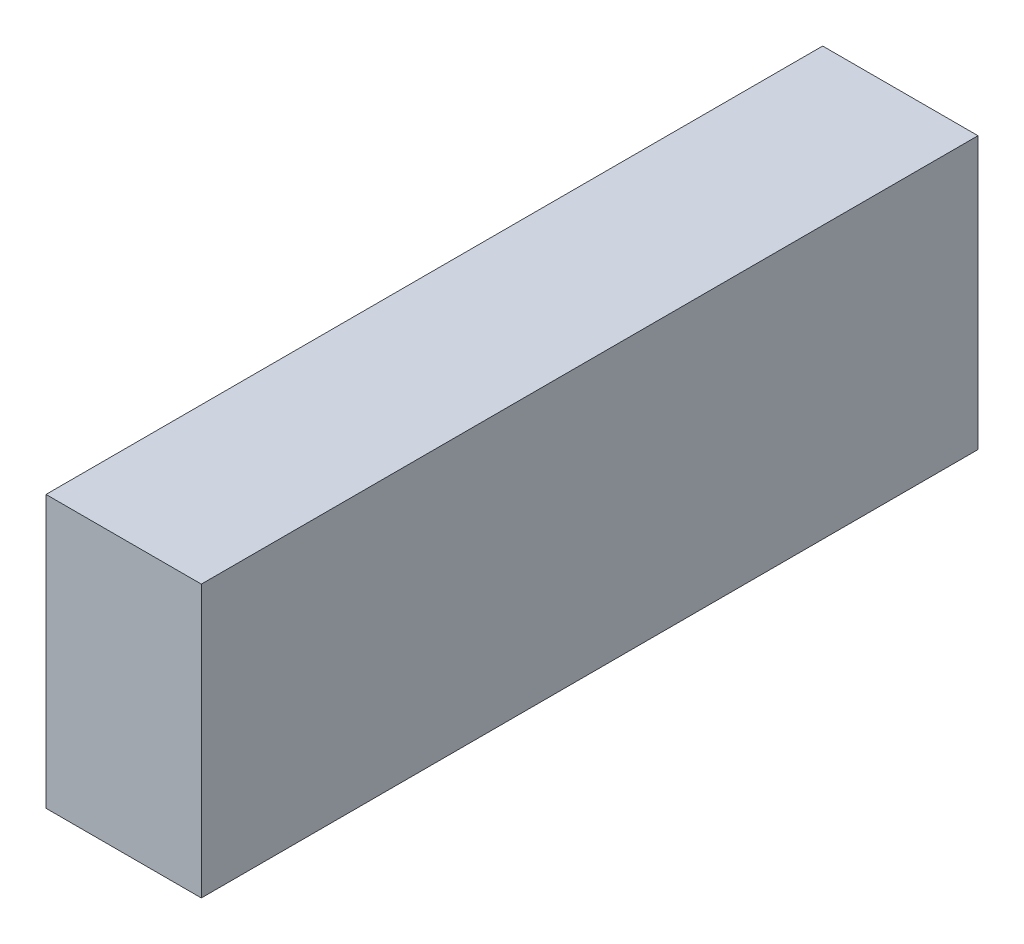
ISO-10303-21;
HEADER;
FILE_DESCRIPTION(('STEP AP214'),'2;1');
FILE_NAME('part.step','',(''),(''),'','','');
FILE_SCHEMA(('AUTOMOTIVE_DESIGN { 1 0 10303 214 1 1 1 1 }'));
ENDSEC;
DATA;
#1=APPLICATION_CONTEXT('core data for automotive mechanical design processes');
#2=APPLICATION_PROTOCOL_DEFINITION('international standard','automotive_design',2000,#1);
#3=PRODUCT_CONTEXT('',#1,'mechanical');
#4=PRODUCT('Part','Part','',(#3));
#5=PRODUCT_RELATED_PRODUCT_CATEGORY('part','',(#4));
#6=PRODUCT_DEFINITION_FORMATION('','',#4);
#7=PRODUCT_DEFINITION_CONTEXT('part definition',#1,'design');
#8=PRODUCT_DEFINITION('design','',#6,#7);
#9=PRODUCT_DEFINITION_SHAPE('','',#8);
#10=(LENGTH_UNIT() NAMED_UNIT(*) SI_UNIT(.MILLI.,.METRE.));
#11=(NAMED_UNIT(*) PLANE_ANGLE_UNIT() SI_UNIT($,.RADIAN.));
#12=(NAMED_UNIT(*) SI_UNIT($,.STERADIAN.) SOLID_ANGLE_UNIT());
#13=UNCERTAINTY_MEASURE_WITH_UNIT(LENGTH_MEASURE(1.E-05),#10,'distance_accuracy_value','');
#14=(GEOMETRIC_REPRESENTATION_CONTEXT(3) GLOBAL_UNCERTAINTY_ASSIGNED_CONTEXT((#13)) GLOBAL_UNIT_ASSIGNED_CONTEXT((#10,
#11,#12)) REPRESENTATION_CONTEXT('',''));
#15=CARTESIAN_POINT('',(0.,0.,0.));
#16=DIRECTION('',(0.,0.,1.));
#17=DIRECTION('',(1.,0.,0.));
#18=AXIS2_PLACEMENT_3D('',#15,#16,#17);
#19=CARTESIAN_POINT('',(20.,-17.5,50.));
#20=DIRECTION('',(0.,0.,-1.));
#21=DIRECTION('',(-1.,0.,0.));
#22=AXIS2_PLACEMENT_3D('',#19,#20,#21);
#23=PLANE('',#22);
#24=DIRECTION('',(0.,-1.,0.));
#25=VECTOR('',#24,1.);
#26=CARTESIAN_POINT('',(0.,-17.5,50.));
#27=LINE('',#26,#25);
#28=CARTESIAN_POINT('',(0.,17.5,50.));
#29=VERTEX_POINT('',#28);
#30=CARTESIAN_POINT('',(0.,-17.5,50.));
#31=VERTEX_POINT('',#30);
#32=EDGE_CURVE('E96',#29,#31,#27,.T.);
#33=ORIENTED_EDGE('',*,*,#32,.T.);
#34=DIRECTION('',(-1.,0.,0.));
#35=VECTOR('',#34,1.);
#36=CARTESIAN_POINT('',(20.,-17.5,50.));
#37=LINE('',#36,#35);
#38=CARTESIAN_POINT('',(20.,-17.5,50.));
#39=VERTEX_POINT('',#38);
#40=EDGE_CURVE('E11',#39,#31,#37,.T.);
#41=ORIENTED_EDGE('',*,*,#40,.F.);
#42=DIRECTION('',(0.,-1.,0.));
#43=VECTOR('',#42,1.);
#44=CARTESIAN_POINT('',(20.,-17.5,50.));
#45=LINE('',#44,#43);
#46=CARTESIAN_POINT('',(20.,17.5,50.));
#47=VERTEX_POINT('',#46);
#48=EDGE_CURVE('E84',#47,#39,#45,.T.);
#49=ORIENTED_EDGE('',*,*,#48,.F.);
#50=DIRECTION('',(-1.,0.,0.));
#51=VECTOR('',#50,1.);
#52=CARTESIAN_POINT('',(20.,17.5,50.));
#53=LINE('',#52,#51);
#54=EDGE_CURVE('E92',#47,#29,#53,.T.);
#55=ORIENTED_EDGE('',*,*,#54,.T.);
#56=EDGE_LOOP('',(#33,#41,#49,#55));
#57=FACE_BOUND('',#56,.T.);
#58=ADVANCED_FACE('F33',(#57),#23,.F.);
#59=CARTESIAN_POINT('',(20.,-17.5,-50.));
#60=DIRECTION('',(0.,1.,0.));
#61=DIRECTION('',(0.,0.,1.));
#62=AXIS2_PLACEMENT_3D('',#59,#60,#61);
#63=PLANE('',#62);
#64=DIRECTION('',(0.,0.,-1.));
#65=VECTOR('',#64,1.);
#66=CARTESIAN_POINT('',(0.,-17.5,-50.));
#67=LINE('',#66,#65);
#68=CARTESIAN_POINT('',(0.,-17.5,-50.));
#69=VERTEX_POINT('',#68);
#70=EDGE_CURVE('E88',#31,#69,#67,.T.);
#71=ORIENTED_EDGE('',*,*,#70,.T.);
#72=DIRECTION('',(-1.,0.,0.));
#73=VECTOR('',#72,1.);
#74=CARTESIAN_POINT('',(20.,-17.5,-50.));
#75=LINE('',#74,#73);
#76=CARTESIAN_POINT('',(20.,-17.5,-50.));
#77=VERTEX_POINT('',#76);
#78=EDGE_CURVE('E41',#77,#69,#75,.T.);
#79=ORIENTED_EDGE('',*,*,#78,.F.);
#80=DIRECTION('',(0.,0.,-1.));
#81=VECTOR('',#80,1.);
#82=CARTESIAN_POINT('',(20.,-17.5,-50.));
#83=LINE('',#82,#81);
#84=EDGE_CURVE('E79',#39,#77,#83,.T.);
#85=ORIENTED_EDGE('',*,*,#84,.F.);
#86=ORIENTED_EDGE('',*,*,#40,.T.);
#87=EDGE_LOOP('',(#71,#79,#85,#86));
#88=FACE_BOUND('',#87,.T.);
#89=ADVANCED_FACE('F87',(#88),#63,.F.);
#90=CARTESIAN_POINT('',(20.,-17.5,-50.));
#91=DIRECTION('',(0.,0.,1.));
#92=DIRECTION('',(1.,0.,0.));
#93=AXIS2_PLACEMENT_3D('',#90,#91,#92);
#94=PLANE('',#93);
#95=DIRECTION('',(0.,1.,0.));
#96=VECTOR('',#95,1.);
#97=CARTESIAN_POINT('',(0.,-17.5,-50.));
#98=LINE('',#97,#96);
#99=CARTESIAN_POINT('',(0.,17.5,-50.));
#100=VERTEX_POINT('',#99);
#101=EDGE_CURVE('E66',#69,#100,#98,.T.);
#102=ORIENTED_EDGE('',*,*,#101,.T.);
#103=DIRECTION('',(-1.,0.,0.));
#104=VECTOR('',#103,1.);
#105=CARTESIAN_POINT('',(20.,17.5,-50.));
#106=LINE('',#105,#104);
#107=CARTESIAN_POINT('',(20.,17.5,-50.));
#108=VERTEX_POINT('',#107);
#109=EDGE_CURVE('E89',#108,#100,#106,.T.);
#110=ORIENTED_EDGE('',*,*,#109,.F.);
#111=DIRECTION('',(0.,1.,0.));
#112=VECTOR('',#111,1.);
#113=CARTESIAN_POINT('',(20.,-17.5,-50.));
#114=LINE('',#113,#112);
#115=EDGE_CURVE('E82',#77,#108,#114,.T.);
#116=ORIENTED_EDGE('',*,*,#115,.F.);
#117=ORIENTED_EDGE('',*,*,#78,.T.);
#118=EDGE_LOOP('',(#102,#110,#116,#117));
#119=FACE_BOUND('',#118,.T.);
#120=ADVANCED_FACE('F90',(#119),#94,.F.);
#121=CARTESIAN_POINT('',(20.,17.5,-50.));
#122=DIRECTION('',(0.,-1.,0.));
#123=DIRECTION('',(0.,0.,-1.));
#124=AXIS2_PLACEMENT_3D('',#121,#122,#123);
#125=PLANE('',#124);
#126=DIRECTION('',(0.,0.,1.));
#127=VECTOR('',#126,1.);
#128=CARTESIAN_POINT('',(0.,17.5,-50.));
#129=LINE('',#128,#127);
#130=EDGE_CURVE('E72',#100,#29,#129,.T.);
#131=ORIENTED_EDGE('',*,*,#130,.T.);
#132=ORIENTED_EDGE('',*,*,#54,.F.);
#133=DIRECTION('',(0.,0.,1.));
#134=VECTOR('',#133,1.);
#135=CARTESIAN_POINT('',(20.,17.5,-50.));
#136=LINE('',#135,#134);
#137=EDGE_CURVE('E49',#108,#47,#136,.T.);
#138=ORIENTED_EDGE('',*,*,#137,.F.);
#139=ORIENTED_EDGE('',*,*,#109,.T.);
#140=EDGE_LOOP('',(#131,#132,#138,#139));
#141=FACE_BOUND('',#140,.T.);
#142=ADVANCED_FACE('F103',(#141),#125,.F.);
#143=CARTESIAN_POINT('',(20.,0.,0.));
#144=DIRECTION('',(1.,0.,0.));
#145=DIRECTION('',(0.,0.,-1.));
#146=AXIS2_PLACEMENT_3D('',#143,#144,#145);
#147=PLANE('',#146);
#148=ORIENTED_EDGE('',*,*,#48,.T.);
#149=ORIENTED_EDGE('',*,*,#84,.T.);
#150=ORIENTED_EDGE('',*,*,#115,.T.);
#151=ORIENTED_EDGE('',*,*,#137,.T.);
#152=EDGE_LOOP('',(#148,#149,#150,#151));
#153=FACE_BOUND('',#152,.T.);
#154=ADVANCED_FACE('F80',(#153),#147,.T.);
#155=CARTESIAN_POINT('',(0.,0.,0.));
#156=DIRECTION('',(1.,0.,0.));
#157=DIRECTION('',(0.,0.,-1.));
#158=AXIS2_PLACEMENT_3D('',#155,#156,#157);
#159=PLANE('',#158);
#160=ORIENTED_EDGE('',*,*,#32,.F.);
#161=ORIENTED_EDGE('',*,*,#130,.F.);
#162=ORIENTED_EDGE('',*,*,#101,.F.);
#163=ORIENTED_EDGE('',*,*,#70,.F.);
#164=EDGE_LOOP('',(#160,#161,#162,#163));
#165=FACE_BOUND('',#164,.T.);
#166=ADVANCED_FACE('F106',(#165),#159,.F.);
#167=CLOSED_SHELL('',(#58,#89,#120,#142,#154,#166));
#168=MANIFOLD_SOLID_BREP('B2',#167);
#169=ADVANCED_BREP_SHAPE_REPRESENTATION('',(#18,#168),#14);
#170=SHAPE_DEFINITION_REPRESENTATION(#9,#169);
ENDSEC;
END-ISO-10303-21;
